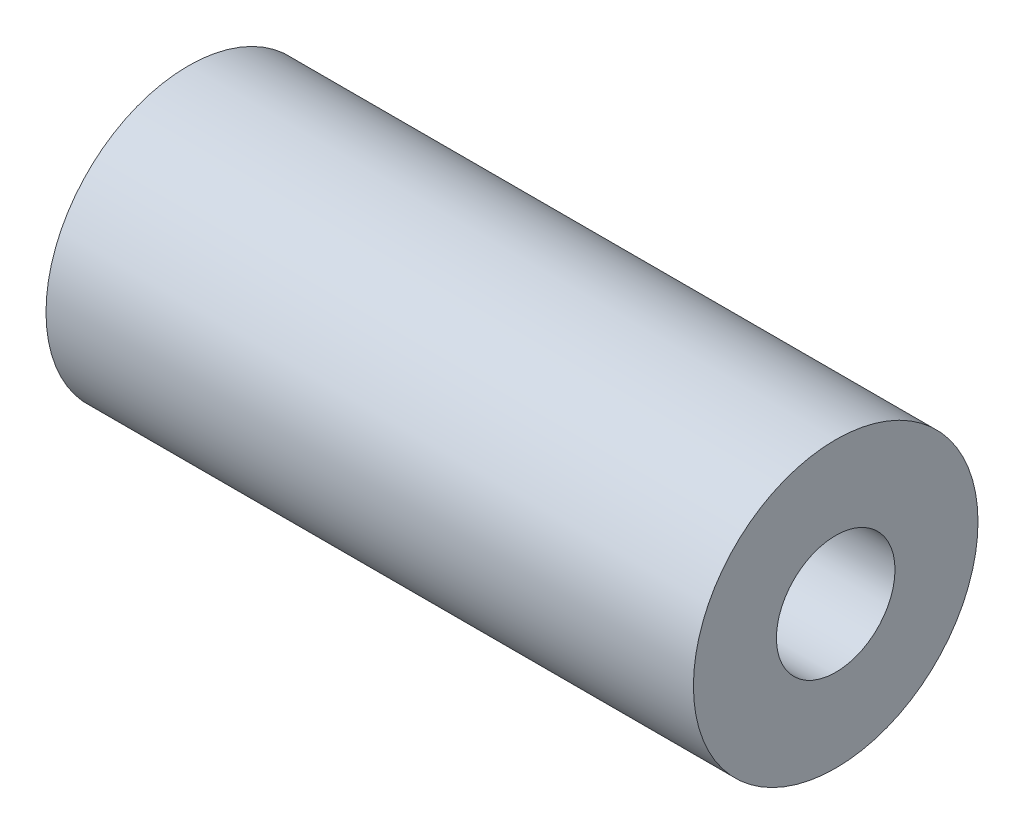
ISO-10303-21;
HEADER;
FILE_DESCRIPTION(('STEP AP214'),'2;1');
FILE_NAME('part.step','',(''),(''),'','','');
FILE_SCHEMA(('AUTOMOTIVE_DESIGN { 1 0 10303 214 1 1 1 1 }'));
ENDSEC;
DATA;
#1=APPLICATION_CONTEXT('core data for automotive mechanical design processes');
#2=APPLICATION_PROTOCOL_DEFINITION('international standard','automotive_design',2000,#1);
#3=PRODUCT_CONTEXT('',#1,'mechanical');
#4=PRODUCT('Part','Part','',(#3));
#5=PRODUCT_RELATED_PRODUCT_CATEGORY('part','',(#4));
#6=PRODUCT_DEFINITION_FORMATION('','',#4);
#7=PRODUCT_DEFINITION_CONTEXT('part definition',#1,'design');
#8=PRODUCT_DEFINITION('design','',#6,#7);
#9=PRODUCT_DEFINITION_SHAPE('','',#8);
#10=(LENGTH_UNIT() NAMED_UNIT(*) SI_UNIT(.MILLI.,.METRE.));
#11=(NAMED_UNIT(*) PLANE_ANGLE_UNIT() SI_UNIT($,.RADIAN.));
#12=(NAMED_UNIT(*) SI_UNIT($,.STERADIAN.) SOLID_ANGLE_UNIT());
#13=UNCERTAINTY_MEASURE_WITH_UNIT(LENGTH_MEASURE(1.E-05),#10,'distance_accuracy_value','');
#14=(GEOMETRIC_REPRESENTATION_CONTEXT(3) GLOBAL_UNCERTAINTY_ASSIGNED_CONTEXT((#13)) GLOBAL_UNIT_ASSIGNED_CONTEXT((#10,
#11,#12)) REPRESENTATION_CONTEXT('',''));
#15=CARTESIAN_POINT('',(0.,0.,0.));
#16=DIRECTION('',(0.,0.,1.));
#17=DIRECTION('',(1.,0.,0.));
#18=AXIS2_PLACEMENT_3D('',#15,#16,#17);
#19=CARTESIAN_POINT('',(13.65,0.,0.));
#20=DIRECTION('',(-1.,0.,0.));
#21=DIRECTION('',(0.,0.,1.));
#22=AXIS2_PLACEMENT_3D('',#19,#20,#21);
#23=CYLINDRICAL_SURFACE('',#22,3.);
#24=CARTESIAN_POINT('',(13.65,0.,0.));
#25=DIRECTION('',(1.,0.,0.));
#26=DIRECTION('',(0.,0.,-1.));
#27=AXIS2_PLACEMENT_3D('',#24,#25,#26);
#28=CIRCLE('',#27,3.);
#29=CARTESIAN_POINT('',(13.65,0.,-3.));
#30=VERTEX_POINT('',#29);
#31=EDGE_CURVE('E10',#30,#30,#28,.T.);
#32=ORIENTED_EDGE('',*,*,#31,.F.);
#33=EDGE_LOOP('',(#32));
#34=FACE_BOUND('',#33,.T.);
#35=CARTESIAN_POINT('',(0.,0.,0.));
#36=DIRECTION('',(1.,0.,0.));
#37=DIRECTION('',(0.,0.,-1.));
#38=AXIS2_PLACEMENT_3D('',#35,#36,#37);
#39=CIRCLE('',#38,3.);
#40=CARTESIAN_POINT('',(0.,0.,-3.));
#41=VERTEX_POINT('',#40);
#42=EDGE_CURVE('E44',#41,#41,#39,.T.);
#43=ORIENTED_EDGE('',*,*,#42,.T.);
#44=EDGE_LOOP('',(#43));
#45=FACE_BOUND('',#44,.T.);
#46=ADVANCED_FACE('F41',(#34,#45),#23,.T.);
#47=CARTESIAN_POINT('',(13.65,0.,0.));
#48=DIRECTION('',(1.,0.,0.));
#49=DIRECTION('',(0.,0.,-1.));
#50=AXIS2_PLACEMENT_3D('',#47,#48,#49);
#51=PLANE('',#50);
#52=CARTESIAN_POINT('',(13.65,0.,0.));
#53=DIRECTION('',(1.,0.,0.));
#54=DIRECTION('',(0.,0.,-1.));
#55=AXIS2_PLACEMENT_3D('',#52,#53,#54);
#56=CIRCLE('',#55,1.24999999999999);
#57=CARTESIAN_POINT('',(13.65,0.,-1.24999999999999));
#58=VERTEX_POINT('',#57);
#59=EDGE_CURVE('E58',#58,#58,#56,.T.);
#60=ORIENTED_EDGE('',*,*,#59,.F.);
#61=EDGE_LOOP('',(#60));
#62=FACE_BOUND('',#61,.T.);
#63=ORIENTED_EDGE('',*,*,#31,.T.);
#64=EDGE_LOOP('',(#63));
#65=FACE_BOUND('',#64,.T.);
#66=ADVANCED_FACE('F65',(#62,#65),#51,.T.);
#67=CARTESIAN_POINT('',(0.,0.,0.));
#68=DIRECTION('',(1.,0.,0.));
#69=DIRECTION('',(0.,0.,-1.));
#70=AXIS2_PLACEMENT_3D('',#67,#68,#69);
#71=PLANE('',#70);
#72=CARTESIAN_POINT('',(0.,0.,0.));
#73=DIRECTION('',(1.,0.,0.));
#74=DIRECTION('',(0.,0.,-1.));
#75=AXIS2_PLACEMENT_3D('',#72,#73,#74);
#76=CIRCLE('',#75,1.25);
#77=CARTESIAN_POINT('',(0.,0.,-1.25));
#78=VERTEX_POINT('',#77);
#79=EDGE_CURVE('E53',#78,#78,#76,.T.);
#80=ORIENTED_EDGE('',*,*,#79,.T.);
#81=EDGE_LOOP('',(#80));
#82=FACE_BOUND('',#81,.T.);
#83=ORIENTED_EDGE('',*,*,#42,.F.);
#84=EDGE_LOOP('',(#83));
#85=FACE_BOUND('',#84,.T.);
#86=ADVANCED_FACE('F67',(#82,#85),#71,.F.);
#87=CARTESIAN_POINT('',(13.65,0.,0.));
#88=DIRECTION('',(1.,0.,0.));
#89=DIRECTION('',(0.,0.,-1.));
#90=AXIS2_PLACEMENT_3D('',#87,#88,#89);
#91=CYLINDRICAL_SURFACE('',#90,1.24999999999999);
#92=ORIENTED_EDGE('',*,*,#79,.F.);
#93=EDGE_LOOP('',(#92));
#94=FACE_BOUND('',#93,.T.);
#95=ORIENTED_EDGE('',*,*,#59,.T.);
#96=EDGE_LOOP('',(#95));
#97=FACE_BOUND('',#96,.T.);
#98=ADVANCED_FACE('F63',(#94,#97),#91,.F.);
#99=CLOSED_SHELL('',(#46,#66,#86,#98));
#100=MANIFOLD_SOLID_BREP('B2',#99);
#101=ADVANCED_BREP_SHAPE_REPRESENTATION('',(#18,#100),#14);
#102=SHAPE_DEFINITION_REPRESENTATION(#9,#101);
ENDSEC;
END-ISO-10303-21;
